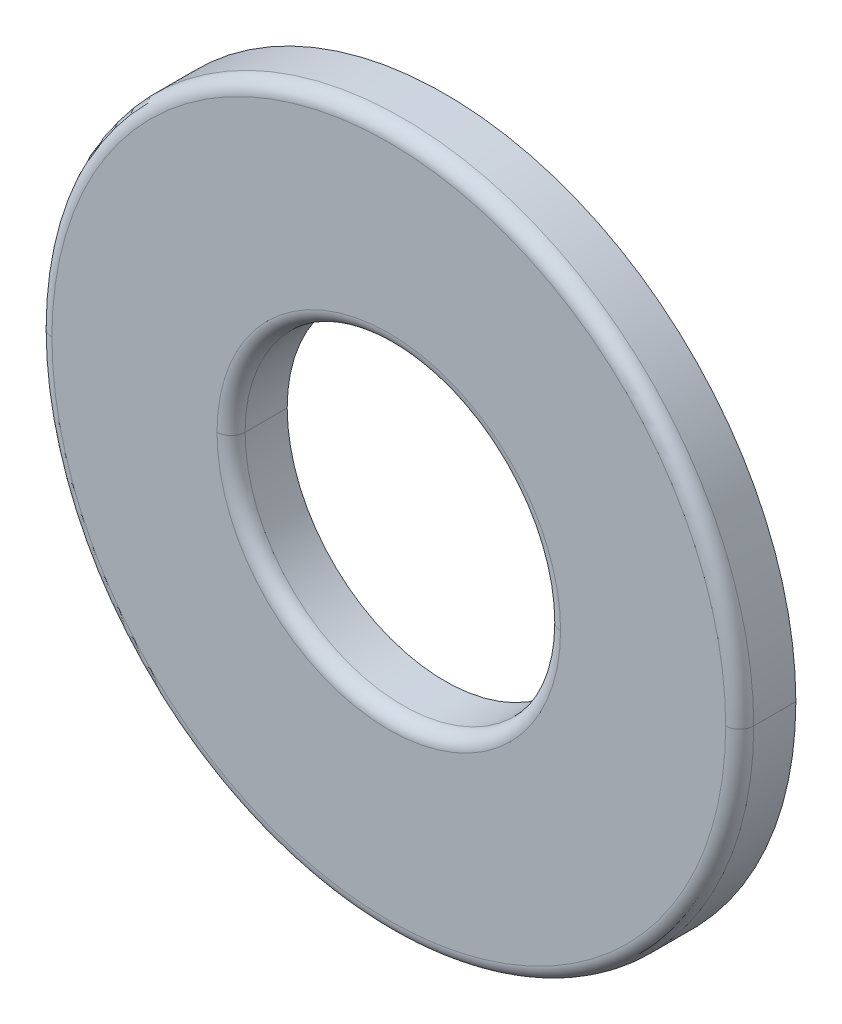
ISO-10303-21;
HEADER;
FILE_DESCRIPTION(('STEP AP214'),'2;1');
FILE_NAME('part.step','',(''),(''),'','','');
FILE_SCHEMA(('AUTOMOTIVE_DESIGN { 1 0 10303 214 1 1 1 1 }'));
ENDSEC;
DATA;
#1=APPLICATION_CONTEXT('core data for automotive mechanical design processes');
#2=APPLICATION_PROTOCOL_DEFINITION('international standard','automotive_design',2000,#1);
#3=PRODUCT_CONTEXT('',#1,'mechanical');
#4=PRODUCT('Part','Part','',(#3));
#5=PRODUCT_RELATED_PRODUCT_CATEGORY('part','',(#4));
#6=PRODUCT_DEFINITION_FORMATION('','',#4);
#7=PRODUCT_DEFINITION_CONTEXT('part definition',#1,'design');
#8=PRODUCT_DEFINITION('design','',#6,#7);
#9=PRODUCT_DEFINITION_SHAPE('','',#8);
#10=(LENGTH_UNIT() NAMED_UNIT(*) SI_UNIT(.MILLI.,.METRE.));
#11=(NAMED_UNIT(*) PLANE_ANGLE_UNIT() SI_UNIT($,.RADIAN.));
#12=(NAMED_UNIT(*) SI_UNIT($,.STERADIAN.) SOLID_ANGLE_UNIT());
#13=UNCERTAINTY_MEASURE_WITH_UNIT(LENGTH_MEASURE(1.E-05),#10,'distance_accuracy_value','');
#14=(GEOMETRIC_REPRESENTATION_CONTEXT(3) GLOBAL_UNCERTAINTY_ASSIGNED_CONTEXT((#13)) GLOBAL_UNIT_ASSIGNED_CONTEXT((#10,
#11,#12)) REPRESENTATION_CONTEXT('',''));
#15=CARTESIAN_POINT('',(0.,0.,0.));
#16=DIRECTION('',(0.,0.,1.));
#17=DIRECTION('',(1.,0.,0.));
#18=AXIS2_PLACEMENT_3D('',#15,#16,#17);
#19=CARTESIAN_POINT('',(0.,0.,0.3175));
#20=DIRECTION('',(0.,0.,1.));
#21=DIRECTION('',(1.,0.,0.));
#22=AXIS2_PLACEMENT_3D('',#19,#20,#21);
#23=TOROIDAL_SURFACE('',#22,3.8862,0.3175);
#24=CARTESIAN_POINT('',(-3.8862,0.,0.3175));
#25=DIRECTION('',(0.,1.,0.));
#26=DIRECTION('',(-1.,0.,0.));
#27=AXIS2_PLACEMENT_3D('',#24,#25,#26);
#28=CIRCLE('',#27,0.3175);
#29=CARTESIAN_POINT('',(-3.8862,0.,0.635));
#30=VERTEX_POINT('',#29);
#31=CARTESIAN_POINT('',(-3.5687,0.,0.3175));
#32=VERTEX_POINT('',#31);
#33=EDGE_CURVE('E100',#30,#32,#28,.T.);
#34=ORIENTED_EDGE('',*,*,#33,.F.);
#35=CARTESIAN_POINT('',(0.,0.,0.635));
#36=DIRECTION('',(0.,0.,-1.));
#37=DIRECTION('',(1.,0.,0.));
#38=AXIS2_PLACEMENT_3D('',#35,#36,#37);
#39=CIRCLE('',#38,3.8862);
#40=CARTESIAN_POINT('',(3.8862,0.,0.635));
#41=VERTEX_POINT('',#40);
#42=EDGE_CURVE('E85',#41,#30,#39,.T.);
#43=ORIENTED_EDGE('',*,*,#42,.F.);
#44=CARTESIAN_POINT('',(3.8862,0.,0.3175));
#45=DIRECTION('',(0.,-1.,0.));
#46=DIRECTION('',(0.,0.,-1.));
#47=AXIS2_PLACEMENT_3D('',#44,#45,#46);
#48=CIRCLE('',#47,0.3175);
#49=CARTESIAN_POINT('',(3.5687,0.,0.3175));
#50=VERTEX_POINT('',#49);
#51=EDGE_CURVE('E110',#41,#50,#48,.T.);
#52=ORIENTED_EDGE('',*,*,#51,.T.);
#53=CARTESIAN_POINT('',(0.,0.,0.3175));
#54=DIRECTION('',(0.,0.,1.));
#55=DIRECTION('',(1.,0.,0.));
#56=AXIS2_PLACEMENT_3D('',#53,#54,#55);
#57=CIRCLE('',#56,3.5687);
#58=EDGE_CURVE('E102',#32,#50,#57,.T.);
#59=ORIENTED_EDGE('',*,*,#58,.F.);
#60=EDGE_LOOP('',(#34,#43,#52,#59));
#61=FACE_BOUND('',#60,.T.);
#62=ADVANCED_FACE('F15',(#61),#23,.T.);
#63=CARTESIAN_POINT('',(0.,0.,0.3175));
#64=DIRECTION('',(0.,0.,1.));
#65=DIRECTION('',(1.,0.,0.));
#66=AXIS2_PLACEMENT_3D('',#63,#64,#65);
#67=TOROIDAL_SURFACE('',#66,7.62,0.3175);
#68=CARTESIAN_POINT('',(-7.62,0.,0.3175));
#69=DIRECTION('',(0.,1.,0.));
#70=DIRECTION('',(-1.,0.,0.));
#71=AXIS2_PLACEMENT_3D('',#68,#69,#70);
#72=CIRCLE('',#71,0.3175);
#73=CARTESIAN_POINT('',(-7.9375,0.,0.3175));
#74=VERTEX_POINT('',#73);
#75=CARTESIAN_POINT('',(-7.62,0.,0.635));
#76=VERTEX_POINT('',#75);
#77=EDGE_CURVE('E136',#74,#76,#72,.T.);
#78=ORIENTED_EDGE('',*,*,#77,.F.);
#79=CARTESIAN_POINT('',(0.,0.,0.3175));
#80=DIRECTION('',(0.,0.,-1.));
#81=DIRECTION('',(1.,0.,0.));
#82=AXIS2_PLACEMENT_3D('',#79,#80,#81);
#83=CIRCLE('',#82,7.9375);
#84=CARTESIAN_POINT('',(7.9375,0.,0.3175));
#85=VERTEX_POINT('',#84);
#86=EDGE_CURVE('E95',#85,#74,#83,.T.);
#87=ORIENTED_EDGE('',*,*,#86,.F.);
#88=CARTESIAN_POINT('',(7.62,0.,0.3175));
#89=DIRECTION('',(0.,-1.,0.));
#90=DIRECTION('',(0.,0.,-1.));
#91=AXIS2_PLACEMENT_3D('',#88,#89,#90);
#92=CIRCLE('',#91,0.3175);
#93=CARTESIAN_POINT('',(7.62,0.,0.635));
#94=VERTEX_POINT('',#93);
#95=EDGE_CURVE('E129',#85,#94,#92,.T.);
#96=ORIENTED_EDGE('',*,*,#95,.T.);
#97=CARTESIAN_POINT('',(0.,0.,0.635));
#98=DIRECTION('',(0.,0.,1.));
#99=DIRECTION('',(1.,0.,0.));
#100=AXIS2_PLACEMENT_3D('',#97,#98,#99);
#101=CIRCLE('',#100,7.62);
#102=EDGE_CURVE('E96',#76,#94,#101,.T.);
#103=ORIENTED_EDGE('',*,*,#102,.F.);
#104=EDGE_LOOP('',(#78,#87,#96,#103));
#105=FACE_BOUND('',#104,.T.);
#106=ADVANCED_FACE('F17',(#105),#67,.T.);
#107=CARTESIAN_POINT('',(0.,0.,-0.635));
#108=DIRECTION('',(0.,0.,1.));
#109=DIRECTION('',(1.,0.,0.));
#110=AXIS2_PLACEMENT_3D('',#107,#108,#109);
#111=PLANE('',#110);
#112=CARTESIAN_POINT('',(0.,0.,-0.635));
#113=DIRECTION('',(0.,0.,1.));
#114=DIRECTION('',(1.,0.,0.));
#115=AXIS2_PLACEMENT_3D('',#112,#113,#114);
#116=CIRCLE('',#115,3.5687);
#117=CARTESIAN_POINT('',(-3.5687,0.,-0.635));
#118=VERTEX_POINT('',#117);
#119=CARTESIAN_POINT('',(3.5687,0.,-0.635));
#120=VERTEX_POINT('',#119);
#121=EDGE_CURVE('E121',#118,#120,#116,.T.);
#122=ORIENTED_EDGE('',*,*,#121,.T.);
#123=CARTESIAN_POINT('',(0.,0.,-0.635));
#124=DIRECTION('',(0.,0.,1.));
#125=DIRECTION('',(1.,0.,0.));
#126=AXIS2_PLACEMENT_3D('',#123,#124,#125);
#127=CIRCLE('',#126,3.5687);
#128=EDGE_CURVE('E9',#120,#118,#127,.T.);
#129=ORIENTED_EDGE('',*,*,#128,.T.);
#130=EDGE_LOOP('',(#122,#129));
#131=FACE_BOUND('',#130,.T.);
#132=CARTESIAN_POINT('',(0.,0.,-0.635));
#133=DIRECTION('',(0.,0.,1.));
#134=DIRECTION('',(1.,0.,0.));
#135=AXIS2_PLACEMENT_3D('',#132,#133,#134);
#136=CIRCLE('',#135,7.9375);
#137=CARTESIAN_POINT('',(-7.9375,0.,-0.635));
#138=VERTEX_POINT('',#137);
#139=CARTESIAN_POINT('',(7.9375,0.,-0.635));
#140=VERTEX_POINT('',#139);
#141=EDGE_CURVE('E24',#138,#140,#136,.T.);
#142=ORIENTED_EDGE('',*,*,#141,.F.);
#143=CARTESIAN_POINT('',(0.,0.,-0.635));
#144=DIRECTION('',(0.,0.,1.));
#145=DIRECTION('',(1.,0.,0.));
#146=AXIS2_PLACEMENT_3D('',#143,#144,#145);
#147=CIRCLE('',#146,7.9375);
#148=EDGE_CURVE('E155',#140,#138,#147,.T.);
#149=ORIENTED_EDGE('',*,*,#148,.F.);
#150=EDGE_LOOP('',(#142,#149));
#151=FACE_BOUND('',#150,.T.);
#152=ADVANCED_FACE('F253',(#131,#151),#111,.F.);
#153=CARTESIAN_POINT('',(0.,0.,0.635));
#154=DIRECTION('',(0.,0.,-1.));
#155=DIRECTION('',(-1.,0.,0.));
#156=AXIS2_PLACEMENT_3D('',#153,#154,#155);
#157=CYLINDRICAL_SURFACE('',#156,3.5687);
#158=DIRECTION('',(0.,0.,-1.));
#159=VECTOR('',#158,1.);
#160=CARTESIAN_POINT('',(3.5687,0.,0.635));
#161=LINE('',#160,#159);
#162=EDGE_CURVE('E124',#50,#120,#161,.T.);
#163=ORIENTED_EDGE('',*,*,#162,.F.);
#164=CARTESIAN_POINT('',(0.,0.,0.3175));
#165=DIRECTION('',(0.,0.,1.));
#166=DIRECTION('',(1.,0.,0.));
#167=AXIS2_PLACEMENT_3D('',#164,#165,#166);
#168=CIRCLE('',#167,3.5687);
#169=EDGE_CURVE('E107',#50,#32,#168,.T.);
#170=ORIENTED_EDGE('',*,*,#169,.T.);
#171=DIRECTION('',(0.,0.,-1.));
#172=VECTOR('',#171,1.);
#173=CARTESIAN_POINT('',(-3.5687,0.,0.635));
#174=LINE('',#173,#172);
#175=EDGE_CURVE('E123',#32,#118,#174,.T.);
#176=ORIENTED_EDGE('',*,*,#175,.T.);
#177=ORIENTED_EDGE('',*,*,#128,.F.);
#178=EDGE_LOOP('',(#163,#170,#176,#177));
#179=FACE_BOUND('',#178,.T.);
#180=ADVANCED_FACE('F181',(#179),#157,.F.);
#181=CARTESIAN_POINT('',(0.,0.,0.635));
#182=DIRECTION('',(0.,0.,-1.));
#183=DIRECTION('',(-1.,0.,0.));
#184=AXIS2_PLACEMENT_3D('',#181,#182,#183);
#185=CYLINDRICAL_SURFACE('',#184,7.9375);
#186=DIRECTION('',(0.,0.,-1.));
#187=VECTOR('',#186,1.);
#188=CARTESIAN_POINT('',(7.9375,0.,0.635));
#189=LINE('',#188,#187);
#190=EDGE_CURVE('E151',#85,#140,#189,.T.);
#191=ORIENTED_EDGE('',*,*,#190,.F.);
#192=ORIENTED_EDGE('',*,*,#86,.T.);
#193=DIRECTION('',(0.,0.,-1.));
#194=VECTOR('',#193,1.);
#195=CARTESIAN_POINT('',(-7.9375,0.,0.635));
#196=LINE('',#195,#194);
#197=EDGE_CURVE('E128',#74,#138,#196,.T.);
#198=ORIENTED_EDGE('',*,*,#197,.T.);
#199=ORIENTED_EDGE('',*,*,#141,.T.);
#200=EDGE_LOOP('',(#191,#192,#198,#199));
#201=FACE_BOUND('',#200,.T.);
#202=ADVANCED_FACE('F176',(#201),#185,.T.);
#203=CARTESIAN_POINT('',(0.,0.,0.635));
#204=DIRECTION('',(0.,0.,1.));
#205=DIRECTION('',(1.,0.,0.));
#206=AXIS2_PLACEMENT_3D('',#203,#204,#205);
#207=PLANE('',#206);
#208=ORIENTED_EDGE('',*,*,#42,.T.);
#209=CARTESIAN_POINT('',(0.,0.,0.635));
#210=DIRECTION('',(0.,0.,-1.));
#211=DIRECTION('',(1.,0.,0.));
#212=AXIS2_PLACEMENT_3D('',#209,#210,#211);
#213=CIRCLE('',#212,3.8862);
#214=EDGE_CURVE('E90',#30,#41,#213,.T.);
#215=ORIENTED_EDGE('',*,*,#214,.T.);
#216=EDGE_LOOP('',(#208,#215));
#217=FACE_BOUND('',#216,.T.);
#218=CARTESIAN_POINT('',(0.,0.,0.635));
#219=DIRECTION('',(0.,0.,1.));
#220=DIRECTION('',(1.,0.,0.));
#221=AXIS2_PLACEMENT_3D('',#218,#219,#220);
#222=CIRCLE('',#221,7.62);
#223=EDGE_CURVE('E133',#94,#76,#222,.T.);
#224=ORIENTED_EDGE('',*,*,#223,.T.);
#225=ORIENTED_EDGE('',*,*,#102,.T.);
#226=EDGE_LOOP('',(#224,#225));
#227=FACE_BOUND('',#226,.T.);
#228=ADVANCED_FACE('F87',(#217,#227),#207,.T.);
#229=CARTESIAN_POINT('',(0.,0.,0.635));
#230=DIRECTION('',(0.,0.,-1.));
#231=DIRECTION('',(-1.,0.,0.));
#232=AXIS2_PLACEMENT_3D('',#229,#230,#231);
#233=CYLINDRICAL_SURFACE('',#232,7.9375);
#234=CARTESIAN_POINT('',(0.,0.,0.3175));
#235=DIRECTION('',(0.,0.,-1.));
#236=DIRECTION('',(1.,0.,0.));
#237=AXIS2_PLACEMENT_3D('',#234,#235,#236);
#238=CIRCLE('',#237,7.9375);
#239=EDGE_CURVE('E119',#74,#85,#238,.T.);
#240=ORIENTED_EDGE('',*,*,#239,.T.);
#241=ORIENTED_EDGE('',*,*,#190,.T.);
#242=ORIENTED_EDGE('',*,*,#148,.T.);
#243=ORIENTED_EDGE('',*,*,#197,.F.);
#244=EDGE_LOOP('',(#240,#241,#242,#243));
#245=FACE_BOUND('',#244,.T.);
#246=ADVANCED_FACE('F215',(#245),#233,.T.);
#247=CARTESIAN_POINT('',(0.,0.,0.635));
#248=DIRECTION('',(0.,0.,-1.));
#249=DIRECTION('',(-1.,0.,0.));
#250=AXIS2_PLACEMENT_3D('',#247,#248,#249);
#251=CYLINDRICAL_SURFACE('',#250,3.5687);
#252=ORIENTED_EDGE('',*,*,#58,.T.);
#253=ORIENTED_EDGE('',*,*,#162,.T.);
#254=ORIENTED_EDGE('',*,*,#121,.F.);
#255=ORIENTED_EDGE('',*,*,#175,.F.);
#256=EDGE_LOOP('',(#252,#253,#254,#255));
#257=FACE_BOUND('',#256,.T.);
#258=ADVANCED_FACE('F195',(#257),#251,.F.);
#259=CARTESIAN_POINT('',(0.,0.,0.3175));
#260=DIRECTION('',(0.,0.,1.));
#261=DIRECTION('',(1.,0.,0.));
#262=AXIS2_PLACEMENT_3D('',#259,#260,#261);
#263=TOROIDAL_SURFACE('',#262,7.62,0.3175);
#264=ORIENTED_EDGE('',*,*,#239,.F.);
#265=ORIENTED_EDGE('',*,*,#77,.T.);
#266=ORIENTED_EDGE('',*,*,#223,.F.);
#267=ORIENTED_EDGE('',*,*,#95,.F.);
#268=EDGE_LOOP('',(#264,#265,#266,#267));
#269=FACE_BOUND('',#268,.T.);
#270=ADVANCED_FACE('F190',(#269),#263,.T.);
#271=CARTESIAN_POINT('',(0.,0.,0.3175));
#272=DIRECTION('',(0.,0.,1.));
#273=DIRECTION('',(1.,0.,0.));
#274=AXIS2_PLACEMENT_3D('',#271,#272,#273);
#275=TOROIDAL_SURFACE('',#274,3.8862,0.3175);
#276=ORIENTED_EDGE('',*,*,#214,.F.);
#277=ORIENTED_EDGE('',*,*,#33,.T.);
#278=ORIENTED_EDGE('',*,*,#169,.F.);
#279=ORIENTED_EDGE('',*,*,#51,.F.);
#280=EDGE_LOOP('',(#276,#277,#278,#279));
#281=FACE_BOUND('',#280,.T.);
#282=ADVANCED_FACE('F109',(#281),#275,.T.);
#283=CLOSED_SHELL('',(#62,#106,#152,#180,#202,#228,#246,#258,#270,#282));
#284=MANIFOLD_SOLID_BREP('B1',#283);
#285=ADVANCED_BREP_SHAPE_REPRESENTATION('',(#18,#284),#14);
#286=SHAPE_DEFINITION_REPRESENTATION(#9,#285);
ENDSEC;
END-ISO-10303-21;
